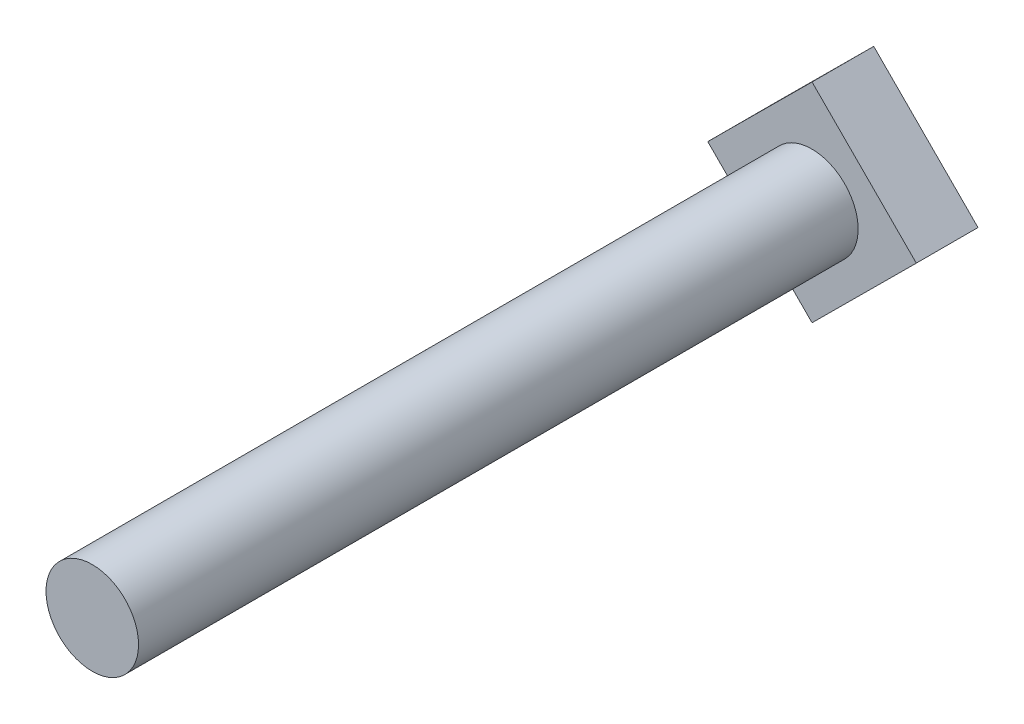
ISO-10303-21;
HEADER;
FILE_DESCRIPTION(('STEP AP214'),'2;1');
FILE_NAME('part.step','',(''),(''),'','','');
FILE_SCHEMA(('AUTOMOTIVE_DESIGN { 1 0 10303 214 1 1 1 1 }'));
ENDSEC;
DATA;
#1=APPLICATION_CONTEXT('core data for automotive mechanical design processes');
#2=APPLICATION_PROTOCOL_DEFINITION('international standard','automotive_design',2000,#1);
#3=PRODUCT_CONTEXT('',#1,'mechanical');
#4=PRODUCT('Part','Part','',(#3));
#5=PRODUCT_RELATED_PRODUCT_CATEGORY('part','',(#4));
#6=PRODUCT_DEFINITION_FORMATION('','',#4);
#7=PRODUCT_DEFINITION_CONTEXT('part definition',#1,'design');
#8=PRODUCT_DEFINITION('design','',#6,#7);
#9=PRODUCT_DEFINITION_SHAPE('','',#8);
#10=(LENGTH_UNIT() NAMED_UNIT(*) SI_UNIT(.MILLI.,.METRE.));
#11=(NAMED_UNIT(*) PLANE_ANGLE_UNIT() SI_UNIT($,.RADIAN.));
#12=(NAMED_UNIT(*) SI_UNIT($,.STERADIAN.) SOLID_ANGLE_UNIT());
#13=UNCERTAINTY_MEASURE_WITH_UNIT(LENGTH_MEASURE(1.E-05),#10,'distance_accuracy_value','');
#14=(GEOMETRIC_REPRESENTATION_CONTEXT(3) GLOBAL_UNCERTAINTY_ASSIGNED_CONTEXT((#13)) GLOBAL_UNIT_ASSIGNED_CONTEXT((#10,
#11,#12)) REPRESENTATION_CONTEXT('',''));
#15=CARTESIAN_POINT('',(0.,0.,0.));
#16=DIRECTION('',(0.,0.,1.));
#17=DIRECTION('',(1.,0.,0.));
#18=AXIS2_PLACEMENT_3D('',#15,#16,#17);
#19=CARTESIAN_POINT('',(-5.05597950018379,0.208317708847282,700.));
#20=DIRECTION('',(0.,0.,-1.));
#21=DIRECTION('',(-1.,0.,0.));
#22=AXIS2_PLACEMENT_3D('',#19,#20,#21);
#23=CYLINDRICAL_SURFACE('',#22,45.);
#24=CARTESIAN_POINT('',(-5.05597950018379,0.208317708847282,700.));
#25=DIRECTION('',(0.,0.,1.));
#26=DIRECTION('',(1.,0.,0.));
#27=AXIS2_PLACEMENT_3D('',#24,#25,#26);
#28=CIRCLE('',#27,45.);
#29=CARTESIAN_POINT('',(39.9440204998162,0.208317708847282,700.));
#30=VERTEX_POINT('',#29);
#31=EDGE_CURVE('E11',#30,#30,#28,.T.);
#32=ORIENTED_EDGE('',*,*,#31,.F.);
#33=EDGE_LOOP('',(#32));
#34=FACE_BOUND('',#33,.T.);
#35=CARTESIAN_POINT('',(-5.05597950018379,0.208317708847282,0.));
#36=DIRECTION('',(0.,0.,-1.));
#37=DIRECTION('',(-1.,0.,0.));
#38=AXIS2_PLACEMENT_3D('',#35,#36,#37);
#39=CIRCLE('',#38,45.);
#40=CARTESIAN_POINT('',(-50.0559795001838,0.208317708847282,0.));
#41=VERTEX_POINT('',#40);
#42=EDGE_CURVE('E43',#41,#41,#39,.T.);
#43=ORIENTED_EDGE('',*,*,#42,.F.);
#44=EDGE_LOOP('',(#43));
#45=FACE_BOUND('',#44,.T.);
#46=ADVANCED_FACE('F35',(#34,#45),#23,.T.);
#47=CARTESIAN_POINT('',(-5.05597950018379,0.208317708847282,700.));
#48=DIRECTION('',(0.,0.,1.));
#49=DIRECTION('',(1.,0.,0.));
#50=AXIS2_PLACEMENT_3D('',#47,#48,#49);
#51=PLANE('',#50);
#52=ORIENTED_EDGE('',*,*,#31,.T.);
#53=EDGE_LOOP('',(#52));
#54=FACE_BOUND('',#53,.T.);
#55=ADVANCED_FACE('F118',(#54),#51,.T.);
#56=CARTESIAN_POINT('',(-228.183092678621,0.35295163461257,0.));
#57=DIRECTION('',(0.,0.,-1.));
#58=DIRECTION('',(-1.,0.,0.));
#59=AXIS2_PLACEMENT_3D('',#56,#57,#58);
#60=PLANE('',#59);
#61=DIRECTION('',(-0.70874158986856,-0.70546818410938,0.));
#62=VECTOR('',#61,1.);
#63=CARTESIAN_POINT('',(-167.782165385216,-60.3282388197897,0.));
#64=LINE('',#63,#62);
#65=CARTESIAN_POINT('',(-4.92504326981657,101.776708667965,0.));
#66=VERTEX_POINT('',#65);
#67=CARTESIAN_POINT('',(-106.333278207914,0.836839499592304,0.));
#68=VERTEX_POINT('',#67);
#69=EDGE_CURVE('E102',#66,#68,#64,.T.);
#70=ORIENTED_EDGE('',*,*,#69,.T.);
#71=DIRECTION('',(0.70546818410938,-0.70874158986856,0.));
#72=VECTOR('',#71,1.);
#73=CARTESIAN_POINT('',(-166.734205501318,61.5180299539946,0.));
#74=LINE('',#73,#72);
#75=CARTESIAN_POINT('',(-4.89630566250037,-101.07080539874,0.));
#76=VERTEX_POINT('',#75);
#77=EDGE_CURVE('E107',#68,#76,#74,.T.);
#78=ORIENTED_EDGE('',*,*,#77,.T.);
#79=DIRECTION('',(-0.70874158986856,-0.70546818410938,0.));
#80=VECTOR('',#79,1.);
#81=CARTESIAN_POINT('',(-66.3451928398029,-162.235883718122,0.));
#82=LINE('',#81,#80);
#83=CARTESIAN_POINT('',(96.511929275597,-0.130936230367223,0.));
#84=VERTEX_POINT('',#83);
#85=EDGE_CURVE('E105',#84,#76,#82,.T.);
#86=ORIENTED_EDGE('',*,*,#85,.F.);
#87=DIRECTION('',(0.70546818410938,-0.70874158986856,0.));
#88=VECTOR('',#87,1.);
#89=CARTESIAN_POINT('',(-65.3259705632208,162.457899122367,0.));
#90=LINE('',#89,#88);
#91=EDGE_CURVE('E92',#66,#84,#90,.T.);
#92=ORIENTED_EDGE('',*,*,#91,.F.);
#93=EDGE_LOOP('',(#70,#78,#86,#92));
#94=FACE_BOUND('',#93,.T.);
#95=ORIENTED_EDGE('',*,*,#42,.T.);
#96=EDGE_LOOP('',(#95));
#97=FACE_BOUND('',#96,.T.);
#98=ADVANCED_FACE('F115',(#94,#97),#60,.F.);
#99=CARTESIAN_POINT('',(-167.782165385216,-60.3282388197897,-60.));
#100=DIRECTION('',(-0.70546818410938,0.70874158986856,0.));
#101=DIRECTION('',(-0.70874158986856,-0.70546818410938,0.));
#102=AXIS2_PLACEMENT_3D('',#99,#100,#101);
#103=PLANE('',#102);
#104=ORIENTED_EDGE('',*,*,#69,.F.);
#105=DIRECTION('',(0.,0.,1.));
#106=VECTOR('',#105,1.);
#107=CARTESIAN_POINT('',(-4.92504326981657,101.776708667965,-60.));
#108=LINE('',#107,#106);
#109=CARTESIAN_POINT('',(-4.92504326981657,101.776708667965,-60.));
#110=VERTEX_POINT('',#109);
#111=EDGE_CURVE('E74',#110,#66,#108,.T.);
#112=ORIENTED_EDGE('',*,*,#111,.F.);
#113=DIRECTION('',(-0.70874158986856,-0.70546818410938,0.));
#114=VECTOR('',#113,1.);
#115=CARTESIAN_POINT('',(-167.782165385216,-60.3282388197897,-60.));
#116=LINE('',#115,#114);
#117=CARTESIAN_POINT('',(-106.333278207914,0.836839499592304,-60.));
#118=VERTEX_POINT('',#117);
#119=EDGE_CURVE('E85',#110,#118,#116,.T.);
#120=ORIENTED_EDGE('',*,*,#119,.T.);
#121=DIRECTION('',(0.,0.,1.));
#122=VECTOR('',#121,1.);
#123=CARTESIAN_POINT('',(-106.333278207914,0.836839499592304,-60.));
#124=LINE('',#123,#122);
#125=EDGE_CURVE('E51',#118,#68,#124,.T.);
#126=ORIENTED_EDGE('',*,*,#125,.T.);
#127=EDGE_LOOP('',(#104,#112,#120,#126));
#128=FACE_BOUND('',#127,.T.);
#129=ADVANCED_FACE('F128',(#128),#103,.T.);
#130=CARTESIAN_POINT('',(-65.3259705632208,162.457899122367,-60.));
#131=DIRECTION('',(-0.70874158986856,-0.70546818410938,0.));
#132=DIRECTION('',(0.70546818410938,-0.70874158986856,0.));
#133=AXIS2_PLACEMENT_3D('',#130,#131,#132);
#134=PLANE('',#133);
#135=ORIENTED_EDGE('',*,*,#91,.T.);
#136=DIRECTION('',(0.,0.,1.));
#137=VECTOR('',#136,1.);
#138=CARTESIAN_POINT('',(96.511929275597,-0.130936230367223,-60.));
#139=LINE('',#138,#137);
#140=CARTESIAN_POINT('',(96.511929275597,-0.130936230367223,-60.));
#141=VERTEX_POINT('',#140);
#142=EDGE_CURVE('E89',#141,#84,#139,.T.);
#143=ORIENTED_EDGE('',*,*,#142,.F.);
#144=DIRECTION('',(0.70546818410938,-0.70874158986856,0.));
#145=VECTOR('',#144,1.);
#146=CARTESIAN_POINT('',(-65.3259705632208,162.457899122367,-60.));
#147=LINE('',#146,#145);
#148=EDGE_CURVE('E79',#110,#141,#147,.T.);
#149=ORIENTED_EDGE('',*,*,#148,.F.);
#150=ORIENTED_EDGE('',*,*,#111,.T.);
#151=EDGE_LOOP('',(#135,#143,#149,#150));
#152=FACE_BOUND('',#151,.T.);
#153=ADVANCED_FACE('F90',(#152),#134,.F.);
#154=CARTESIAN_POINT('',(-66.3451928398029,-162.235883718122,-60.));
#155=DIRECTION('',(-0.70546818410938,0.70874158986856,0.));
#156=DIRECTION('',(-0.70874158986856,-0.70546818410938,0.));
#157=AXIS2_PLACEMENT_3D('',#154,#155,#156);
#158=PLANE('',#157);
#159=ORIENTED_EDGE('',*,*,#85,.T.);
#160=DIRECTION('',(0.,0.,1.));
#161=VECTOR('',#160,1.);
#162=CARTESIAN_POINT('',(-4.89630566250037,-101.07080539874,-60.));
#163=LINE('',#162,#161);
#164=CARTESIAN_POINT('',(-4.89630566250037,-101.07080539874,-60.));
#165=VERTEX_POINT('',#164);
#166=EDGE_CURVE('E66',#165,#76,#163,.T.);
#167=ORIENTED_EDGE('',*,*,#166,.F.);
#168=DIRECTION('',(-0.70874158986856,-0.70546818410938,0.));
#169=VECTOR('',#168,1.);
#170=CARTESIAN_POINT('',(-66.3451928398029,-162.235883718122,-60.));
#171=LINE('',#170,#169);
#172=EDGE_CURVE('E84',#141,#165,#171,.T.);
#173=ORIENTED_EDGE('',*,*,#172,.F.);
#174=ORIENTED_EDGE('',*,*,#142,.T.);
#175=EDGE_LOOP('',(#159,#167,#173,#174));
#176=FACE_BOUND('',#175,.T.);
#177=ADVANCED_FACE('F96',(#176),#158,.F.);
#178=CARTESIAN_POINT('',(-166.734205501318,61.5180299539946,-60.));
#179=DIRECTION('',(-0.70874158986856,-0.70546818410938,0.));
#180=DIRECTION('',(0.70546818410938,-0.70874158986856,0.));
#181=AXIS2_PLACEMENT_3D('',#178,#179,#180);
#182=PLANE('',#181);
#183=ORIENTED_EDGE('',*,*,#77,.F.);
#184=ORIENTED_EDGE('',*,*,#125,.F.);
#185=DIRECTION('',(0.70546818410938,-0.70874158986856,0.));
#186=VECTOR('',#185,1.);
#187=CARTESIAN_POINT('',(-166.734205501318,61.5180299539946,-60.));
#188=LINE('',#187,#186);
#189=EDGE_CURVE('E97',#118,#165,#188,.T.);
#190=ORIENTED_EDGE('',*,*,#189,.T.);
#191=ORIENTED_EDGE('',*,*,#166,.T.);
#192=EDGE_LOOP('',(#183,#184,#190,#191));
#193=FACE_BOUND('',#192,.T.);
#194=ADVANCED_FACE('F138',(#193),#182,.T.);
#195=CARTESIAN_POINT('',(-228.183092678621,0.35295163461257,-60.));
#196=DIRECTION('',(0.,0.,-1.));
#197=DIRECTION('',(-1.,0.,0.));
#198=AXIS2_PLACEMENT_3D('',#195,#196,#197);
#199=PLANE('',#198);
#200=ORIENTED_EDGE('',*,*,#119,.F.);
#201=ORIENTED_EDGE('',*,*,#148,.T.);
#202=ORIENTED_EDGE('',*,*,#172,.T.);
#203=ORIENTED_EDGE('',*,*,#189,.F.);
#204=EDGE_LOOP('',(#200,#201,#202,#203));
#205=FACE_BOUND('',#204,.T.);
#206=ADVANCED_FACE('F81',(#205),#199,.T.);
#207=CLOSED_SHELL('',(#46,#55,#98,#129,#153,#177,#194,#206));
#208=MANIFOLD_SOLID_BREP('B2',#207);
#209=ADVANCED_BREP_SHAPE_REPRESENTATION('',(#18,#208),#14);
#210=SHAPE_DEFINITION_REPRESENTATION(#9,#209);
ENDSEC;
END-ISO-10303-21;
